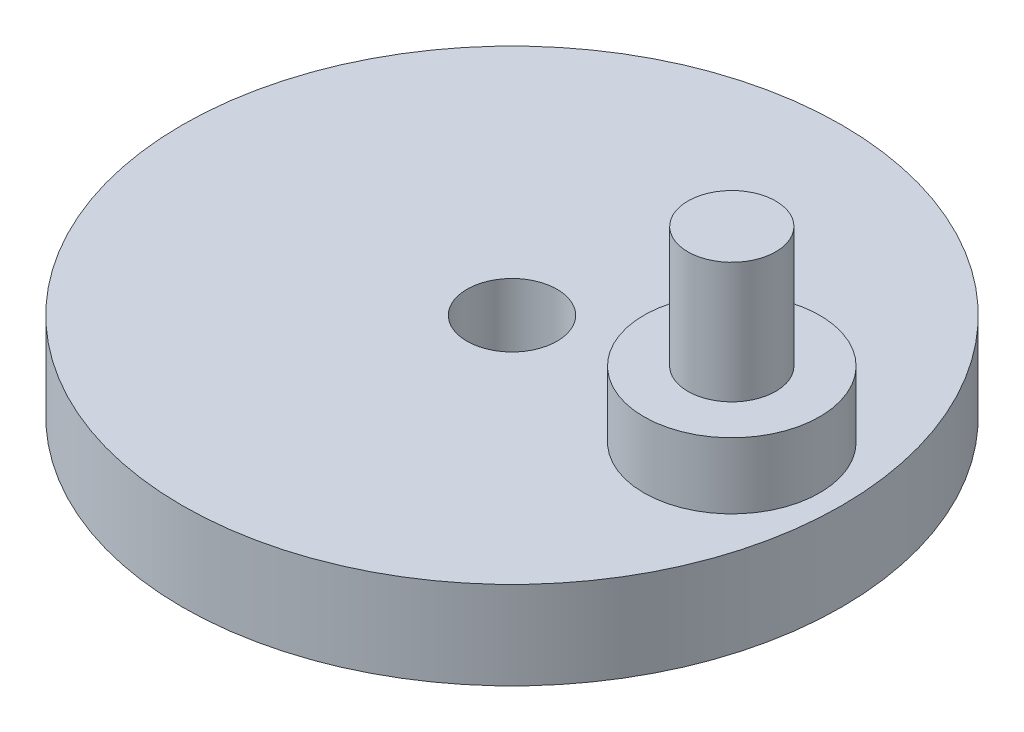
ISO-10303-21;
HEADER;
FILE_DESCRIPTION(('STEP AP214'),'2;1');
FILE_NAME('part.step','',(''),(''),'','','');
FILE_SCHEMA(('AUTOMOTIVE_DESIGN { 1 0 10303 214 1 1 1 1 }'));
ENDSEC;
DATA;
#1=APPLICATION_CONTEXT('core data for automotive mechanical design processes');
#2=APPLICATION_PROTOCOL_DEFINITION('international standard','automotive_design',2000,#1);
#3=PRODUCT_CONTEXT('',#1,'mechanical');
#4=PRODUCT('Part','Part','',(#3));
#5=PRODUCT_RELATED_PRODUCT_CATEGORY('part','',(#4));
#6=PRODUCT_DEFINITION_FORMATION('','',#4);
#7=PRODUCT_DEFINITION_CONTEXT('part definition',#1,'design');
#8=PRODUCT_DEFINITION('design','',#6,#7);
#9=PRODUCT_DEFINITION_SHAPE('','',#8);
#10=(LENGTH_UNIT() NAMED_UNIT(*) SI_UNIT(.MILLI.,.METRE.));
#11=(NAMED_UNIT(*) PLANE_ANGLE_UNIT() SI_UNIT($,.RADIAN.));
#12=(NAMED_UNIT(*) SI_UNIT($,.STERADIAN.) SOLID_ANGLE_UNIT());
#13=UNCERTAINTY_MEASURE_WITH_UNIT(LENGTH_MEASURE(1.E-05),#10,'distance_accuracy_value','');
#14=(GEOMETRIC_REPRESENTATION_CONTEXT(3) GLOBAL_UNCERTAINTY_ASSIGNED_CONTEXT((#13)) GLOBAL_UNIT_ASSIGNED_CONTEXT((#10,
#11,#12)) REPRESENTATION_CONTEXT('',''));
#15=CARTESIAN_POINT('',(0.,0.,0.));
#16=DIRECTION('',(0.,0.,1.));
#17=DIRECTION('',(1.,0.,0.));
#18=AXIS2_PLACEMENT_3D('',#15,#16,#17);
#19=CARTESIAN_POINT('',(0.,8.,0.));
#20=DIRECTION('',(0.,-1.,0.));
#21=DIRECTION('',(0.,0.,-1.));
#22=AXIS2_PLACEMENT_3D('',#19,#20,#21);
#23=CYLINDRICAL_SURFACE('',#22,30.);
#24=CARTESIAN_POINT('',(0.,8.,0.));
#25=DIRECTION('',(0.,1.,0.));
#26=DIRECTION('',(0.,0.,1.));
#27=AXIS2_PLACEMENT_3D('',#24,#25,#26);
#28=CIRCLE('',#27,30.);
#29=CARTESIAN_POINT('',(0.,8.,30.));
#30=VERTEX_POINT('',#29);
#31=EDGE_CURVE('E40',#30,#30,#28,.T.);
#32=ORIENTED_EDGE('',*,*,#31,.F.);
#33=EDGE_LOOP('',(#32));
#34=FACE_BOUND('',#33,.T.);
#35=CARTESIAN_POINT('',(0.,0.,0.));
#36=DIRECTION('',(0.,1.,0.));
#37=DIRECTION('',(0.,0.,1.));
#38=AXIS2_PLACEMENT_3D('',#35,#36,#37);
#39=CIRCLE('',#38,30.);
#40=CARTESIAN_POINT('',(0.,0.,30.));
#41=VERTEX_POINT('',#40);
#42=EDGE_CURVE('E36',#41,#41,#39,.T.);
#43=ORIENTED_EDGE('',*,*,#42,.T.);
#44=EDGE_LOOP('',(#43));
#45=FACE_BOUND('',#44,.T.);
#46=ADVANCED_FACE('F33',(#34,#45),#23,.T.);
#47=CARTESIAN_POINT('',(0.,8.,0.));
#48=DIRECTION('',(0.,1.,0.));
#49=DIRECTION('',(0.,0.,1.));
#50=AXIS2_PLACEMENT_3D('',#47,#48,#49);
#51=PLANE('',#50);
#52=CARTESIAN_POINT('',(20.,8.,0.));
#53=DIRECTION('',(0.,1.,0.));
#54=DIRECTION('',(0.,0.,1.));
#55=AXIS2_PLACEMENT_3D('',#52,#53,#54);
#56=CIRCLE('',#55,8.);
#57=CARTESIAN_POINT('',(20.,8.,8.));
#58=VERTEX_POINT('',#57);
#59=EDGE_CURVE('E52',#58,#58,#56,.T.);
#60=ORIENTED_EDGE('',*,*,#59,.F.);
#61=EDGE_LOOP('',(#60));
#62=FACE_BOUND('',#61,.T.);
#63=CARTESIAN_POINT('',(0.,8.,0.));
#64=DIRECTION('',(0.,1.,0.));
#65=DIRECTION('',(0.,0.,1.));
#66=AXIS2_PLACEMENT_3D('',#63,#64,#65);
#67=CIRCLE('',#66,4.1);
#68=CARTESIAN_POINT('',(0.,8.,4.1));
#69=VERTEX_POINT('',#68);
#70=EDGE_CURVE('E51',#69,#69,#67,.T.);
#71=ORIENTED_EDGE('',*,*,#70,.F.);
#72=EDGE_LOOP('',(#71));
#73=FACE_BOUND('',#72,.T.);
#74=ORIENTED_EDGE('',*,*,#31,.T.);
#75=EDGE_LOOP('',(#74));
#76=FACE_BOUND('',#75,.T.);
#77=ADVANCED_FACE('F63',(#62,#73,#76),#51,.T.);
#78=CARTESIAN_POINT('',(0.,0.,0.));
#79=DIRECTION('',(0.,1.,0.));
#80=DIRECTION('',(0.,0.,1.));
#81=AXIS2_PLACEMENT_3D('',#78,#79,#80);
#82=PLANE('',#81);
#83=CARTESIAN_POINT('',(0.,0.,0.));
#84=DIRECTION('',(0.,1.,0.));
#85=DIRECTION('',(0.,0.,1.));
#86=AXIS2_PLACEMENT_3D('',#83,#84,#85);
#87=CIRCLE('',#86,4.1);
#88=CARTESIAN_POINT('',(0.,0.,4.1));
#89=VERTEX_POINT('',#88);
#90=EDGE_CURVE('E55',#89,#89,#87,.T.);
#91=ORIENTED_EDGE('',*,*,#90,.T.);
#92=EDGE_LOOP('',(#91));
#93=FACE_BOUND('',#92,.T.);
#94=ORIENTED_EDGE('',*,*,#42,.F.);
#95=EDGE_LOOP('',(#94));
#96=FACE_BOUND('',#95,.T.);
#97=ADVANCED_FACE('F66',(#93,#96),#82,.F.);
#98=CARTESIAN_POINT('',(0.,0.,0.));
#99=DIRECTION('',(0.,1.,0.));
#100=DIRECTION('',(0.,0.,1.));
#101=AXIS2_PLACEMENT_3D('',#98,#99,#100);
#102=CYLINDRICAL_SURFACE('',#101,4.1);
#103=ORIENTED_EDGE('',*,*,#90,.F.);
#104=EDGE_LOOP('',(#103));
#105=FACE_BOUND('',#104,.T.);
#106=ORIENTED_EDGE('',*,*,#70,.T.);
#107=EDGE_LOOP('',(#106));
#108=FACE_BOUND('',#107,.T.);
#109=ADVANCED_FACE('F61',(#105,#108),#102,.F.);
#110=CARTESIAN_POINT('',(20.,14.,0.));
#111=DIRECTION('',(0.,-1.,0.));
#112=DIRECTION('',(0.,0.,-1.));
#113=AXIS2_PLACEMENT_3D('',#110,#111,#112);
#114=CYLINDRICAL_SURFACE('',#113,8.);
#115=CARTESIAN_POINT('',(20.,14.,0.));
#116=DIRECTION('',(0.,1.,0.));
#117=DIRECTION('',(0.,0.,1.));
#118=AXIS2_PLACEMENT_3D('',#115,#116,#117);
#119=CIRCLE('',#118,8.);
#120=CARTESIAN_POINT('',(20.,14.,8.));
#121=VERTEX_POINT('',#120);
#122=EDGE_CURVE('E48',#121,#121,#119,.T.);
#123=ORIENTED_EDGE('',*,*,#122,.F.);
#124=EDGE_LOOP('',(#123));
#125=FACE_BOUND('',#124,.T.);
#126=ORIENTED_EDGE('',*,*,#59,.T.);
#127=EDGE_LOOP('',(#126));
#128=FACE_BOUND('',#127,.T.);
#129=ADVANCED_FACE('F81',(#125,#128),#114,.T.);
#130=CARTESIAN_POINT('',(20.,14.,0.));
#131=DIRECTION('',(0.,1.,0.));
#132=DIRECTION('',(0.,0.,1.));
#133=AXIS2_PLACEMENT_3D('',#130,#131,#132);
#134=PLANE('',#133);
#135=CARTESIAN_POINT('',(20.,14.,0.));
#136=DIRECTION('',(0.,1.,0.));
#137=DIRECTION('',(0.,0.,1.));
#138=AXIS2_PLACEMENT_3D('',#135,#136,#137);
#139=CIRCLE('',#138,4.);
#140=CARTESIAN_POINT('',(20.,14.,4.));
#141=VERTEX_POINT('',#140);
#142=EDGE_CURVE('E10',#141,#141,#139,.T.);
#143=ORIENTED_EDGE('',*,*,#142,.F.);
#144=EDGE_LOOP('',(#143));
#145=FACE_BOUND('',#144,.T.);
#146=ORIENTED_EDGE('',*,*,#122,.T.);
#147=EDGE_LOOP('',(#146));
#148=FACE_BOUND('',#147,.T.);
#149=ADVANCED_FACE('F87',(#145,#148),#134,.T.);
#150=CARTESIAN_POINT('',(20.,25.,0.));
#151=DIRECTION('',(0.,-1.,0.));
#152=DIRECTION('',(0.,0.,-1.));
#153=AXIS2_PLACEMENT_3D('',#150,#151,#152);
#154=CYLINDRICAL_SURFACE('',#153,4.);
#155=CARTESIAN_POINT('',(20.,25.,0.));
#156=DIRECTION('',(0.,1.,0.));
#157=DIRECTION('',(0.,0.,1.));
#158=AXIS2_PLACEMENT_3D('',#155,#156,#157);
#159=CIRCLE('',#158,4.);
#160=CARTESIAN_POINT('',(20.,25.,4.));
#161=VERTEX_POINT('',#160);
#162=EDGE_CURVE('E47',#161,#161,#159,.T.);
#163=ORIENTED_EDGE('',*,*,#162,.F.);
#164=EDGE_LOOP('',(#163));
#165=FACE_BOUND('',#164,.T.);
#166=ORIENTED_EDGE('',*,*,#142,.T.);
#167=EDGE_LOOP('',(#166));
#168=FACE_BOUND('',#167,.T.);
#169=ADVANCED_FACE('F91',(#165,#168),#154,.T.);
#170=CARTESIAN_POINT('',(20.,25.,0.));
#171=DIRECTION('',(0.,1.,0.));
#172=DIRECTION('',(0.,0.,1.));
#173=AXIS2_PLACEMENT_3D('',#170,#171,#172);
#174=PLANE('',#173);
#175=ORIENTED_EDGE('',*,*,#162,.T.);
#176=EDGE_LOOP('',(#175));
#177=FACE_BOUND('',#176,.T.);
#178=ADVANCED_FACE('F95',(#177),#174,.T.);
#179=CLOSED_SHELL('',(#46,#77,#97,#109,#129,#149,#169,#178));
#180=MANIFOLD_SOLID_BREP('B2',#179);
#181=ADVANCED_BREP_SHAPE_REPRESENTATION('',(#18,#180),#14);
#182=SHAPE_DEFINITION_REPRESENTATION(#9,#181);
ENDSEC;
END-ISO-10303-21;
